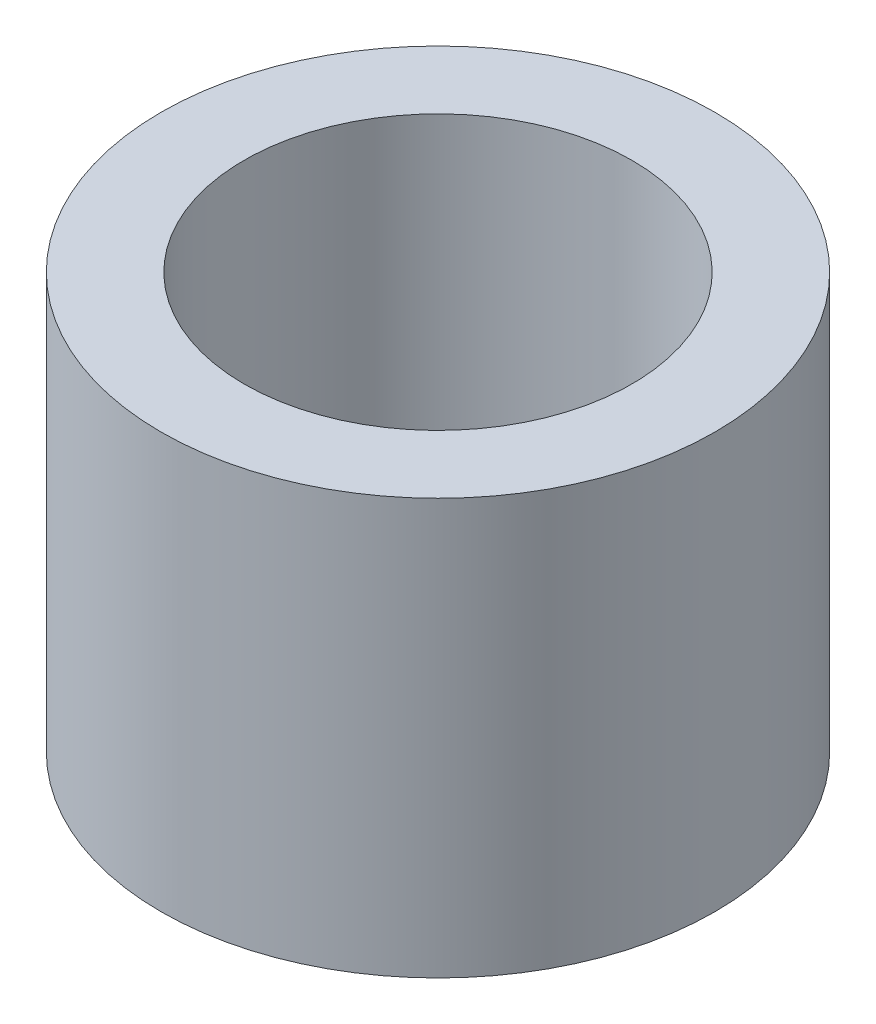
ISO-10303-21;
HEADER;
FILE_DESCRIPTION(('STEP AP214'),'2;1');
FILE_NAME('part.step','',(''),(''),'','','');
FILE_SCHEMA(('AUTOMOTIVE_DESIGN { 1 0 10303 214 1 1 1 1 }'));
ENDSEC;
DATA;
#1=APPLICATION_CONTEXT('core data for automotive mechanical design processes');
#2=APPLICATION_PROTOCOL_DEFINITION('international standard','automotive_design',2000,#1);
#3=PRODUCT_CONTEXT('',#1,'mechanical');
#4=PRODUCT('Part','Part','',(#3));
#5=PRODUCT_RELATED_PRODUCT_CATEGORY('part','',(#4));
#6=PRODUCT_DEFINITION_FORMATION('','',#4);
#7=PRODUCT_DEFINITION_CONTEXT('part definition',#1,'design');
#8=PRODUCT_DEFINITION('design','',#6,#7);
#9=PRODUCT_DEFINITION_SHAPE('','',#8);
#10=(LENGTH_UNIT() NAMED_UNIT(*) SI_UNIT(.MILLI.,.METRE.));
#11=(NAMED_UNIT(*) PLANE_ANGLE_UNIT() SI_UNIT($,.RADIAN.));
#12=(NAMED_UNIT(*) SI_UNIT($,.STERADIAN.) SOLID_ANGLE_UNIT());
#13=UNCERTAINTY_MEASURE_WITH_UNIT(LENGTH_MEASURE(1.E-05),#10,'distance_accuracy_value','');
#14=(GEOMETRIC_REPRESENTATION_CONTEXT(3) GLOBAL_UNCERTAINTY_ASSIGNED_CONTEXT((#13)) GLOBAL_UNIT_ASSIGNED_CONTEXT((#10,
#11,#12)) REPRESENTATION_CONTEXT('',''));
#15=CARTESIAN_POINT('',(0.,0.,0.));
#16=DIRECTION('',(0.,0.,1.));
#17=DIRECTION('',(1.,0.,0.));
#18=AXIS2_PLACEMENT_3D('',#15,#16,#17);
#19=CARTESIAN_POINT('',(0.,15.,0.));
#20=DIRECTION('',(0.,-1.,0.));
#21=DIRECTION('',(0.,0.,-1.));
#22=AXIS2_PLACEMENT_3D('',#19,#20,#21);
#23=CYLINDRICAL_SURFACE('',#22,10.);
#24=CARTESIAN_POINT('',(0.,15.,0.));
#25=DIRECTION('',(0.,1.,0.));
#26=DIRECTION('',(0.,0.,1.));
#27=AXIS2_PLACEMENT_3D('',#24,#25,#26);
#28=CIRCLE('',#27,10.);
#29=CARTESIAN_POINT('',(0.,15.,10.));
#30=VERTEX_POINT('',#29);
#31=EDGE_CURVE('E10',#30,#30,#28,.T.);
#32=ORIENTED_EDGE('',*,*,#31,.F.);
#33=EDGE_LOOP('',(#32));
#34=FACE_BOUND('',#33,.T.);
#35=CARTESIAN_POINT('',(0.,0.,0.));
#36=DIRECTION('',(0.,1.,0.));
#37=DIRECTION('',(0.,0.,1.));
#38=AXIS2_PLACEMENT_3D('',#35,#36,#37);
#39=CIRCLE('',#38,10.);
#40=CARTESIAN_POINT('',(0.,0.,10.));
#41=VERTEX_POINT('',#40);
#42=EDGE_CURVE('E40',#41,#41,#39,.T.);
#43=ORIENTED_EDGE('',*,*,#42,.T.);
#44=EDGE_LOOP('',(#43));
#45=FACE_BOUND('',#44,.T.);
#46=ADVANCED_FACE('F37',(#34,#45),#23,.T.);
#47=CARTESIAN_POINT('',(0.,15.,0.));
#48=DIRECTION('',(0.,1.,0.));
#49=DIRECTION('',(0.,0.,1.));
#50=AXIS2_PLACEMENT_3D('',#47,#48,#49);
#51=PLANE('',#50);
#52=CARTESIAN_POINT('',(0.,15.,0.));
#53=DIRECTION('',(0.,1.,0.));
#54=DIRECTION('',(0.,0.,1.));
#55=AXIS2_PLACEMENT_3D('',#52,#53,#54);
#56=CIRCLE('',#55,7.);
#57=CARTESIAN_POINT('',(0.,15.,7.));
#58=VERTEX_POINT('',#57);
#59=EDGE_CURVE('E49',#58,#58,#56,.T.);
#60=ORIENTED_EDGE('',*,*,#59,.F.);
#61=EDGE_LOOP('',(#60));
#62=FACE_BOUND('',#61,.T.);
#63=ORIENTED_EDGE('',*,*,#31,.T.);
#64=EDGE_LOOP('',(#63));
#65=FACE_BOUND('',#64,.T.);
#66=ADVANCED_FACE('F62',(#62,#65),#51,.T.);
#67=CARTESIAN_POINT('',(0.,0.,0.));
#68=DIRECTION('',(0.,1.,0.));
#69=DIRECTION('',(0.,0.,1.));
#70=AXIS2_PLACEMENT_3D('',#67,#68,#69);
#71=PLANE('',#70);
#72=CARTESIAN_POINT('',(0.,0.,0.));
#73=DIRECTION('',(0.,1.,0.));
#74=DIRECTION('',(0.,0.,1.));
#75=AXIS2_PLACEMENT_3D('',#72,#73,#74);
#76=CIRCLE('',#75,7.);
#77=CARTESIAN_POINT('',(0.,0.,7.));
#78=VERTEX_POINT('',#77);
#79=EDGE_CURVE('E51',#78,#78,#76,.T.);
#80=ORIENTED_EDGE('',*,*,#79,.T.);
#81=EDGE_LOOP('',(#80));
#82=FACE_BOUND('',#81,.T.);
#83=ORIENTED_EDGE('',*,*,#42,.F.);
#84=EDGE_LOOP('',(#83));
#85=FACE_BOUND('',#84,.T.);
#86=ADVANCED_FACE('F64',(#82,#85),#71,.F.);
#87=CARTESIAN_POINT('',(0.,15.,0.));
#88=DIRECTION('',(0.,-1.,0.));
#89=DIRECTION('',(0.,0.,-1.));
#90=AXIS2_PLACEMENT_3D('',#87,#88,#89);
#91=CYLINDRICAL_SURFACE('',#90,7.);
#92=ORIENTED_EDGE('',*,*,#59,.T.);
#93=EDGE_LOOP('',(#92));
#94=FACE_BOUND('',#93,.T.);
#95=ORIENTED_EDGE('',*,*,#79,.F.);
#96=EDGE_LOOP('',(#95));
#97=FACE_BOUND('',#96,.T.);
#98=ADVANCED_FACE('F59',(#94,#97),#91,.F.);
#99=CLOSED_SHELL('',(#46,#66,#86,#98));
#100=MANIFOLD_SOLID_BREP('B2',#99);
#101=ADVANCED_BREP_SHAPE_REPRESENTATION('',(#18,#100),#14);
#102=SHAPE_DEFINITION_REPRESENTATION(#9,#101);
ENDSEC;
END-ISO-10303-21;
